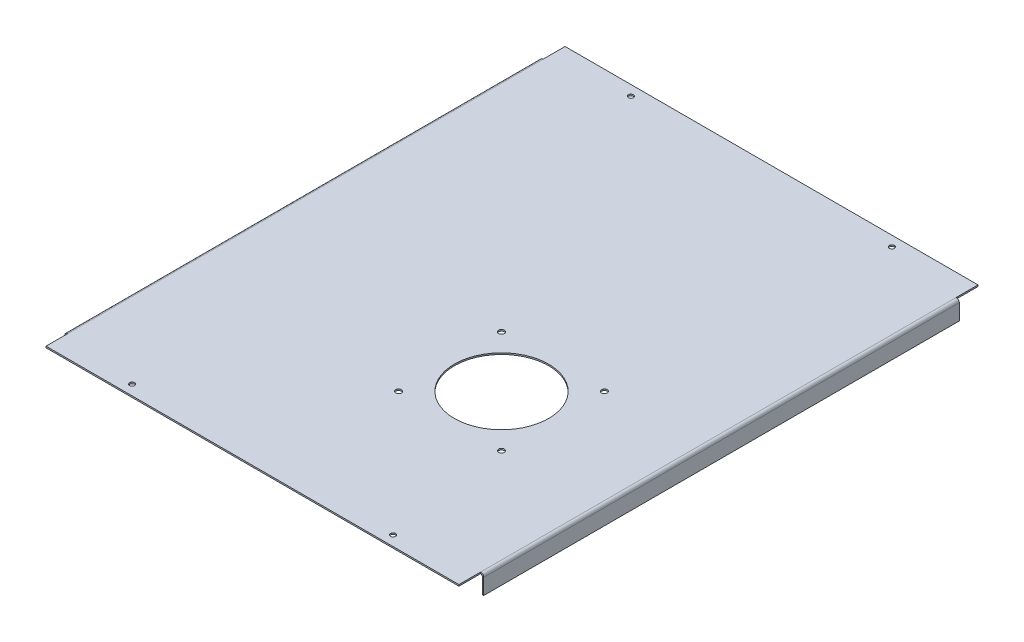
ISO-10303-21;
HEADER;
FILE_DESCRIPTION(('STEP AP214'),'2;1');
FILE_NAME('part.step','',(''),(''),'','','');
FILE_SCHEMA(('AUTOMOTIVE_DESIGN { 1 0 10303 214 1 1 1 1 }'));
ENDSEC;
DATA;
#1=APPLICATION_CONTEXT('core data for automotive mechanical design processes');
#2=APPLICATION_PROTOCOL_DEFINITION('international standard','automotive_design',2000,#1);
#3=PRODUCT_CONTEXT('',#1,'mechanical');
#4=PRODUCT('Part','Part','',(#3));
#5=PRODUCT_RELATED_PRODUCT_CATEGORY('part','',(#4));
#6=PRODUCT_DEFINITION_FORMATION('','',#4);
#7=PRODUCT_DEFINITION_CONTEXT('part definition',#1,'design');
#8=PRODUCT_DEFINITION('design','',#6,#7);
#9=PRODUCT_DEFINITION_SHAPE('','',#8);
#10=(LENGTH_UNIT() NAMED_UNIT(*) SI_UNIT(.MILLI.,.METRE.));
#11=(NAMED_UNIT(*) PLANE_ANGLE_UNIT() SI_UNIT($,.RADIAN.));
#12=(NAMED_UNIT(*) SI_UNIT($,.STERADIAN.) SOLID_ANGLE_UNIT());
#13=UNCERTAINTY_MEASURE_WITH_UNIT(LENGTH_MEASURE(1.E-05),#10,'distance_accuracy_value','');
#14=(GEOMETRIC_REPRESENTATION_CONTEXT(3) GLOBAL_UNCERTAINTY_ASSIGNED_CONTEXT((#13)) GLOBAL_UNIT_ASSIGNED_CONTEXT((#10,
#11,#12)) REPRESENTATION_CONTEXT('',''));
#15=CARTESIAN_POINT('',(0.,0.,0.));
#16=DIRECTION('',(0.,0.,1.));
#17=DIRECTION('',(1.,0.,0.));
#18=AXIS2_PLACEMENT_3D('',#15,#16,#17);
#19=CARTESIAN_POINT('',(0.,-1.,0.));
#20=DIRECTION('',(0.,1.,0.));
#21=DIRECTION('',(0.,0.,1.));
#22=AXIS2_PLACEMENT_3D('',#19,#20,#21);
#23=PLANE('',#22);
#24=CARTESIAN_POINT('',(185.210608040227,-1.,145.66803730873));
#25=DIRECTION('',(0.,-1.,0.));
#26=DIRECTION('',(0.,0.,-1.));
#27=AXIS2_PLACEMENT_3D('',#24,#25,#26);
#28=CIRCLE('',#27,2.);
#29=CARTESIAN_POINT('',(185.210608040227,-1.,143.66803730873));
#30=VERTEX_POINT('',#29);
#31=EDGE_CURVE('E241',#30,#30,#28,.T.);
#32=ORIENTED_EDGE('',*,*,#31,.F.);
#33=EDGE_LOOP('',(#32));
#34=FACE_BOUND('',#33,.T.);
#35=CARTESIAN_POINT('',(114.210608041667,-1.,145.667585056685));
#36=DIRECTION('',(0.,-1.,0.));
#37=DIRECTION('',(0.,0.,-1.));
#38=AXIS2_PLACEMENT_3D('',#35,#36,#37);
#39=CIRCLE('',#38,2.);
#40=CARTESIAN_POINT('',(114.210608041667,-1.,143.667585056685));
#41=VERTEX_POINT('',#40);
#42=EDGE_CURVE('E231',#41,#41,#39,.T.);
#43=ORIENTED_EDGE('',*,*,#42,.F.);
#44=EDGE_LOOP('',(#43));
#45=FACE_BOUND('',#44,.T.);
#46=CARTESIAN_POINT('',(185.210155788181,-1.,216.66803730729));
#47=DIRECTION('',(0.,-1.,0.));
#48=DIRECTION('',(0.,0.,-1.));
#49=AXIS2_PLACEMENT_3D('',#46,#47,#48);
#50=CIRCLE('',#49,2.);
#51=CARTESIAN_POINT('',(185.210155788181,-1.,214.66803730729));
#52=VERTEX_POINT('',#51);
#53=EDGE_CURVE('E228',#52,#52,#50,.T.);
#54=ORIENTED_EDGE('',*,*,#53,.F.);
#55=EDGE_LOOP('',(#54));
#56=FACE_BOUND('',#55,.T.);
#57=CARTESIAN_POINT('',(114.210155789621,-1.,216.667585055244));
#58=DIRECTION('',(0.,-1.,0.));
#59=DIRECTION('',(0.,0.,-1.));
#60=AXIS2_PLACEMENT_3D('',#57,#58,#59);
#61=CIRCLE('',#60,2.);
#62=CARTESIAN_POINT('',(114.210155789621,-1.,214.667585055244));
#63=VERTEX_POINT('',#62);
#64=EDGE_CURVE('E225',#63,#63,#61,.T.);
#65=ORIENTED_EDGE('',*,*,#64,.F.);
#66=EDGE_LOOP('',(#65));
#67=FACE_BOUND('',#66,.T.);
#68=CARTESIAN_POINT('',(149.710381914924,-0.999999999999999,181.167811181987));
#69=DIRECTION('',(0.,1.,0.));
#70=DIRECTION('',(0.,0.,1.));
#71=AXIS2_PLACEMENT_3D('',#68,#69,#70);
#72=CIRCLE('',#71,32.5);
#73=CARTESIAN_POINT('',(149.710381914924,-0.999999999999999,213.667811181987));
#74=VERTEX_POINT('',#73);
#75=EDGE_CURVE('E248',#74,#74,#72,.T.);
#76=ORIENTED_EDGE('',*,*,#75,.T.);
#77=EDGE_LOOP('',(#76));
#78=FACE_BOUND('',#77,.T.);
#79=CARTESIAN_POINT('',(198.072246784864,-0.999999999999999,-39.7062514296918));
#80=DIRECTION('',(0.,1.,0.));
#81=DIRECTION('',(0.,0.,1.));
#82=AXIS2_PLACEMENT_3D('',#79,#80,#81);
#83=CIRCLE('',#82,1.75000000000001);
#84=CARTESIAN_POINT('',(198.072246784864,-0.999999999999999,-37.9562514296918));
#85=VERTEX_POINT('',#84);
#86=EDGE_CURVE('E254',#85,#85,#83,.T.);
#87=ORIENTED_EDGE('',*,*,#86,.T.);
#88=EDGE_LOOP('',(#87));
#89=FACE_BOUND('',#88,.T.);
#90=CARTESIAN_POINT('',(18.0722467848644,-0.999999999999999,-39.7062514296918));
#91=DIRECTION('',(0.,1.,0.));
#92=DIRECTION('',(0.,0.,1.));
#93=AXIS2_PLACEMENT_3D('',#90,#91,#92);
#94=CIRCLE('',#93,1.75);
#95=CARTESIAN_POINT('',(18.0722467848644,-0.999999999999999,-37.9562514296918));
#96=VERTEX_POINT('',#95);
#97=EDGE_CURVE('E260',#96,#96,#94,.T.);
#98=ORIENTED_EDGE('',*,*,#97,.T.);
#99=EDGE_LOOP('',(#98));
#100=FACE_BOUND('',#99,.T.);
#101=CARTESIAN_POINT('',(198.072246784864,-0.999999999999999,304.293748570308));
#102=DIRECTION('',(0.,1.,0.));
#103=DIRECTION('',(0.,0.,1.));
#104=AXIS2_PLACEMENT_3D('',#101,#102,#103);
#105=CIRCLE('',#104,1.75000000000001);
#106=CARTESIAN_POINT('',(198.072246784864,-0.999999999999999,306.043748570308));
#107=VERTEX_POINT('',#106);
#108=EDGE_CURVE('E266',#107,#107,#105,.T.);
#109=ORIENTED_EDGE('',*,*,#108,.T.);
#110=EDGE_LOOP('',(#109));
#111=FACE_BOUND('',#110,.T.);
#112=CARTESIAN_POINT('',(18.0722467848645,-0.999999999999999,304.293748570308));
#113=DIRECTION('',(0.,1.,0.));
#114=DIRECTION('',(0.,0.,1.));
#115=AXIS2_PLACEMENT_3D('',#112,#113,#114);
#116=CIRCLE('',#115,1.75);
#117=CARTESIAN_POINT('',(18.0722467848645,-0.999999999999999,306.043748570308));
#118=VERTEX_POINT('',#117);
#119=EDGE_CURVE('E156',#118,#118,#116,.T.);
#120=ORIENTED_EDGE('',*,*,#119,.T.);
#121=EDGE_LOOP('',(#120));
#122=FACE_BOUND('',#121,.T.);
#123=DIRECTION('',(0.,0.,-1.));
#124=VECTOR('',#123,1.);
#125=CARTESIAN_POINT('',(-34.3277532151356,-1.00000000000002,-46.7062514296918));
#126=LINE('',#125,#124);
#127=CARTESIAN_POINT('',(-34.3277532151356,-1.00000000000001,-46.7062514296918));
#128=VERTEX_POINT('',#127);
#129=CARTESIAN_POINT('',(-34.3277532151356,-1.00000000000001,-31.7062514296919));
#130=VERTEX_POINT('',#129);
#131=EDGE_CURVE('E166',#128,#130,#126,.F.);
#132=ORIENTED_EDGE('',*,*,#131,.F.);
#133=DIRECTION('',(-1.,0.,0.));
#134=VECTOR('',#133,1.);
#135=CARTESIAN_POINT('',(-35.4277532151356,-1.,-46.7062514296918));
#136=LINE('',#135,#134);
#137=CARTESIAN_POINT('',(250.472246784864,-1.00000000000006,-46.7062514296918));
#138=VERTEX_POINT('',#137);
#139=EDGE_CURVE('E206',#138,#128,#136,.T.);
#140=ORIENTED_EDGE('',*,*,#139,.F.);
#141=DIRECTION('',(0.,0.,1.));
#142=VECTOR('',#141,1.);
#143=CARTESIAN_POINT('',(250.472246784864,-1.00000000000006,311.293748570308));
#144=LINE('',#143,#142);
#145=CARTESIAN_POINT('',(250.472246784864,-1.00000000000006,-31.7062514296918));
#146=VERTEX_POINT('',#145);
#147=EDGE_CURVE('E188',#146,#138,#144,.F.);
#148=ORIENTED_EDGE('',*,*,#147,.F.);
#149=CARTESIAN_POINT('',(250.472246784864,-1.00000000000007,296.293748570308));
#150=VERTEX_POINT('',#149);
#151=EDGE_CURVE('E197',#150,#146,#144,.F.);
#152=ORIENTED_EDGE('',*,*,#151,.F.);
#153=CARTESIAN_POINT('',(250.472246784864,-1.00000000000007,311.293748570308));
#154=VERTEX_POINT('',#153);
#155=EDGE_CURVE('E195',#154,#150,#144,.F.);
#156=ORIENTED_EDGE('',*,*,#155,.F.);
#157=DIRECTION('',(1.,0.,0.));
#158=VECTOR('',#157,1.);
#159=CARTESIAN_POINT('',(-35.4277532151355,-1.,311.293748570308));
#160=LINE('',#159,#158);
#161=CARTESIAN_POINT('',(-34.3277532151355,-1.00000000000001,311.293748570308));
#162=VERTEX_POINT('',#161);
#163=EDGE_CURVE('E203',#162,#154,#160,.T.);
#164=ORIENTED_EDGE('',*,*,#163,.F.);
#165=CARTESIAN_POINT('',(-34.3277532151355,-1.00000000000001,296.293748570308));
#166=VERTEX_POINT('',#165);
#167=EDGE_CURVE('E161',#166,#162,#126,.F.);
#168=ORIENTED_EDGE('',*,*,#167,.F.);
#169=EDGE_CURVE('E164',#130,#166,#126,.F.);
#170=ORIENTED_EDGE('',*,*,#169,.F.);
#171=EDGE_LOOP('',(#132,#140,#148,#152,#156,#164,#168,#170));
#172=FACE_BOUND('',#171,.T.);
#173=ADVANCED_FACE('F34',(#34,#45,#56,#67,#78,#89,#100,#111,#122,#172),#23,.F.);
#174=CARTESIAN_POINT('',(0.,0.,0.));
#175=DIRECTION('',(0.,1.,0.));
#176=DIRECTION('',(0.,0.,1.));
#177=AXIS2_PLACEMENT_3D('',#174,#175,#176);
#178=PLANE('',#177);
#179=CARTESIAN_POINT('',(185.210608040227,0.,145.66803730873));
#180=DIRECTION('',(0.,1.,0.));
#181=DIRECTION('',(0.,0.,1.));
#182=AXIS2_PLACEMENT_3D('',#179,#180,#181);
#183=CIRCLE('',#182,2.);
#184=CARTESIAN_POINT('',(185.210608040227,0.,147.66803730873));
#185=VERTEX_POINT('',#184);
#186=EDGE_CURVE('E38',#185,#185,#183,.T.);
#187=ORIENTED_EDGE('',*,*,#186,.F.);
#188=EDGE_LOOP('',(#187));
#189=FACE_BOUND('',#188,.T.);
#190=CARTESIAN_POINT('',(114.210608041667,0.,145.667585056685));
#191=DIRECTION('',(0.,1.,0.));
#192=DIRECTION('',(0.,0.,1.));
#193=AXIS2_PLACEMENT_3D('',#190,#191,#192);
#194=CIRCLE('',#193,2.);
#195=CARTESIAN_POINT('',(114.210608041667,0.,147.667585056685));
#196=VERTEX_POINT('',#195);
#197=EDGE_CURVE('E229',#196,#196,#194,.T.);
#198=ORIENTED_EDGE('',*,*,#197,.F.);
#199=EDGE_LOOP('',(#198));
#200=FACE_BOUND('',#199,.T.);
#201=CARTESIAN_POINT('',(185.210155788181,0.,216.66803730729));
#202=DIRECTION('',(0.,1.,0.));
#203=DIRECTION('',(0.,0.,1.));
#204=AXIS2_PLACEMENT_3D('',#201,#202,#203);
#205=CIRCLE('',#204,2.);
#206=CARTESIAN_POINT('',(185.210155788181,0.,218.66803730729));
#207=VERTEX_POINT('',#206);
#208=EDGE_CURVE('E226',#207,#207,#205,.T.);
#209=ORIENTED_EDGE('',*,*,#208,.F.);
#210=EDGE_LOOP('',(#209));
#211=FACE_BOUND('',#210,.T.);
#212=CARTESIAN_POINT('',(114.210155789621,0.,216.667585055244));
#213=DIRECTION('',(0.,1.,0.));
#214=DIRECTION('',(0.,0.,1.));
#215=AXIS2_PLACEMENT_3D('',#212,#213,#214);
#216=CIRCLE('',#215,2.);
#217=CARTESIAN_POINT('',(114.210155789621,0.,218.667585055244));
#218=VERTEX_POINT('',#217);
#219=EDGE_CURVE('E221',#218,#218,#216,.T.);
#220=ORIENTED_EDGE('',*,*,#219,.F.);
#221=EDGE_LOOP('',(#220));
#222=FACE_BOUND('',#221,.T.);
#223=CARTESIAN_POINT('',(149.710381914924,0.,181.167811181987));
#224=DIRECTION('',(0.,1.,0.));
#225=DIRECTION('',(0.,0.,1.));
#226=AXIS2_PLACEMENT_3D('',#223,#224,#225);
#227=CIRCLE('',#226,32.5);
#228=CARTESIAN_POINT('',(149.710381914924,0.,213.667811181987));
#229=VERTEX_POINT('',#228);
#230=EDGE_CURVE('E224',#229,#229,#227,.T.);
#231=ORIENTED_EDGE('',*,*,#230,.F.);
#232=EDGE_LOOP('',(#231));
#233=FACE_BOUND('',#232,.T.);
#234=CARTESIAN_POINT('',(198.072246784864,0.,-39.7062514296918));
#235=DIRECTION('',(0.,1.,0.));
#236=DIRECTION('',(0.,0.,1.));
#237=AXIS2_PLACEMENT_3D('',#234,#235,#236);
#238=CIRCLE('',#237,1.75000000000001);
#239=CARTESIAN_POINT('',(198.072246784864,0.,-37.9562514296918));
#240=VERTEX_POINT('',#239);
#241=EDGE_CURVE('E251',#240,#240,#238,.T.);
#242=ORIENTED_EDGE('',*,*,#241,.F.);
#243=EDGE_LOOP('',(#242));
#244=FACE_BOUND('',#243,.T.);
#245=CARTESIAN_POINT('',(18.0722467848644,0.,-39.7062514296918));
#246=DIRECTION('',(0.,1.,0.));
#247=DIRECTION('',(0.,0.,1.));
#248=AXIS2_PLACEMENT_3D('',#245,#246,#247);
#249=CIRCLE('',#248,1.75);
#250=CARTESIAN_POINT('',(18.0722467848644,0.,-37.9562514296918));
#251=VERTEX_POINT('',#250);
#252=EDGE_CURVE('E257',#251,#251,#249,.T.);
#253=ORIENTED_EDGE('',*,*,#252,.F.);
#254=EDGE_LOOP('',(#253));
#255=FACE_BOUND('',#254,.T.);
#256=CARTESIAN_POINT('',(198.072246784864,0.,304.293748570308));
#257=DIRECTION('',(0.,1.,0.));
#258=DIRECTION('',(0.,0.,1.));
#259=AXIS2_PLACEMENT_3D('',#256,#257,#258);
#260=CIRCLE('',#259,1.75000000000001);
#261=CARTESIAN_POINT('',(198.072246784864,0.,306.043748570308));
#262=VERTEX_POINT('',#261);
#263=EDGE_CURVE('E263',#262,#262,#260,.T.);
#264=ORIENTED_EDGE('',*,*,#263,.F.);
#265=EDGE_LOOP('',(#264));
#266=FACE_BOUND('',#265,.T.);
#267=CARTESIAN_POINT('',(18.0722467848645,0.,304.293748570308));
#268=DIRECTION('',(0.,1.,0.));
#269=DIRECTION('',(0.,0.,1.));
#270=AXIS2_PLACEMENT_3D('',#267,#268,#269);
#271=CIRCLE('',#270,1.75);
#272=CARTESIAN_POINT('',(18.0722467848645,0.,306.043748570308));
#273=VERTEX_POINT('',#272);
#274=EDGE_CURVE('E269',#273,#273,#271,.T.);
#275=ORIENTED_EDGE('',*,*,#274,.F.);
#276=EDGE_LOOP('',(#275));
#277=FACE_BOUND('',#276,.T.);
#278=DIRECTION('',(-1.,0.,0.));
#279=VECTOR('',#278,1.);
#280=CARTESIAN_POINT('',(-35.4277532151356,0.,-46.7062514296918));
#281=LINE('',#280,#279);
#282=CARTESIAN_POINT('',(250.472246784864,0.,-46.7062514296918));
#283=VERTEX_POINT('',#282);
#284=CARTESIAN_POINT('',(-34.3277532151356,0.,-46.7062514296918));
#285=VERTEX_POINT('',#284);
#286=EDGE_CURVE('E207',#283,#285,#281,.T.);
#287=ORIENTED_EDGE('',*,*,#286,.T.);
#288=DIRECTION('',(0.,0.,-1.));
#289=VECTOR('',#288,1.);
#290=CARTESIAN_POINT('',(-34.3277532151356,0.,-46.7062514296918));
#291=LINE('',#290,#289);
#292=CARTESIAN_POINT('',(-34.3277532151356,0.,-31.7062514296919));
#293=VERTEX_POINT('',#292);
#294=EDGE_CURVE('E171',#285,#293,#291,.F.);
#295=ORIENTED_EDGE('',*,*,#294,.T.);
#296=CARTESIAN_POINT('',(-34.3277532151355,0.,296.293748570308));
#297=VERTEX_POINT('',#296);
#298=EDGE_CURVE('E174',#293,#297,#291,.F.);
#299=ORIENTED_EDGE('',*,*,#298,.T.);
#300=DIRECTION('',(0.,0.,-1.));
#301=VECTOR('',#300,1.);
#302=CARTESIAN_POINT('',(-34.3277532151357,0.,-46.7062514296918));
#303=LINE('',#302,#301);
#304=CARTESIAN_POINT('',(-34.3277532151355,0.,311.293748570308));
#305=VERTEX_POINT('',#304);
#306=EDGE_CURVE('E295',#297,#305,#303,.F.);
#307=ORIENTED_EDGE('',*,*,#306,.T.);
#308=DIRECTION('',(1.,0.,0.));
#309=VECTOR('',#308,1.);
#310=CARTESIAN_POINT('',(-35.4277532151355,0.,311.293748570308));
#311=LINE('',#310,#309);
#312=CARTESIAN_POINT('',(250.472246784864,0.,311.293748570308));
#313=VERTEX_POINT('',#312);
#314=EDGE_CURVE('E200',#305,#313,#311,.T.);
#315=ORIENTED_EDGE('',*,*,#314,.T.);
#316=DIRECTION('',(0.,0.,1.));
#317=VECTOR('',#316,1.);
#318=CARTESIAN_POINT('',(250.472246784864,0.,311.293748570308));
#319=LINE('',#318,#317);
#320=CARTESIAN_POINT('',(250.472246784864,0.,296.293748570308));
#321=VERTEX_POINT('',#320);
#322=EDGE_CURVE('E190',#313,#321,#319,.F.);
#323=ORIENTED_EDGE('',*,*,#322,.T.);
#324=CARTESIAN_POINT('',(250.472246784864,0.,-31.7062514296918));
#325=VERTEX_POINT('',#324);
#326=EDGE_CURVE('E194',#321,#325,#319,.F.);
#327=ORIENTED_EDGE('',*,*,#326,.T.);
#328=DIRECTION('',(0.,0.,1.));
#329=VECTOR('',#328,1.);
#330=CARTESIAN_POINT('',(250.472246784864,0.,311.293748570308));
#331=LINE('',#330,#329);
#332=EDGE_CURVE('E324',#325,#283,#331,.F.);
#333=ORIENTED_EDGE('',*,*,#332,.T.);
#334=EDGE_LOOP('',(#287,#295,#299,#307,#315,#323,#327,#333));
#335=FACE_BOUND('',#334,.T.);
#336=ADVANCED_FACE('F352',(#189,#200,#211,#222,#233,#244,#255,#266,#277,#335),#178,.T.);
#337=CARTESIAN_POINT('',(-35.4277532151356,-1.,-46.7062514296918));
#338=DIRECTION('',(0.,0.,-1.));
#339=DIRECTION('',(-1.,0.,0.));
#340=AXIS2_PLACEMENT_3D('',#337,#338,#339);
#341=PLANE('',#340);
#342=ORIENTED_EDGE('',*,*,#139,.T.);
#343=DIRECTION('',(0.,1.,0.));
#344=VECTOR('',#343,1.);
#345=CARTESIAN_POINT('',(-34.3277532151356,-1.00000000000002,-46.7062514296918));
#346=LINE('',#345,#344);
#347=EDGE_CURVE('E173',#128,#285,#346,.T.);
#348=ORIENTED_EDGE('',*,*,#347,.T.);
#349=ORIENTED_EDGE('',*,*,#286,.F.);
#350=DIRECTION('',(0.,1.,0.));
#351=VECTOR('',#350,1.);
#352=CARTESIAN_POINT('',(250.472246784864,-1.00000000000006,-46.7062514296919));
#353=LINE('',#352,#351);
#354=EDGE_CURVE('E198',#138,#283,#353,.T.);
#355=ORIENTED_EDGE('',*,*,#354,.F.);
#356=EDGE_LOOP('',(#342,#348,#349,#355));
#357=FACE_BOUND('',#356,.T.);
#358=ADVANCED_FACE('F358',(#357),#341,.T.);
#359=CARTESIAN_POINT('',(-35.4277532151355,-1.,311.293748570308));
#360=DIRECTION('',(0.,0.,1.));
#361=DIRECTION('',(1.,0.,0.));
#362=AXIS2_PLACEMENT_3D('',#359,#360,#361);
#363=PLANE('',#362);
#364=DIRECTION('',(0.,1.,0.));
#365=VECTOR('',#364,1.);
#366=CARTESIAN_POINT('',(-34.3277532151356,-1.00000000000002,311.293748570308));
#367=LINE('',#366,#365);
#368=EDGE_CURVE('E176',#162,#305,#367,.T.);
#369=ORIENTED_EDGE('',*,*,#368,.F.);
#370=ORIENTED_EDGE('',*,*,#163,.T.);
#371=DIRECTION('',(0.,1.,0.));
#372=VECTOR('',#371,1.);
#373=CARTESIAN_POINT('',(250.472246784864,-1.00000000000006,311.293748570308));
#374=LINE('',#373,#372);
#375=EDGE_CURVE('E193',#154,#313,#374,.T.);
#376=ORIENTED_EDGE('',*,*,#375,.T.);
#377=ORIENTED_EDGE('',*,*,#314,.F.);
#378=EDGE_LOOP('',(#369,#370,#376,#377));
#379=FACE_BOUND('',#378,.T.);
#380=ADVANCED_FACE('F36',(#379),#363,.T.);
#381=CARTESIAN_POINT('',(250.472246784864,-2.1,311.293748570308));
#382=DIRECTION('',(0.,0.,1.));
#383=DIRECTION('',(1.,0.,0.));
#384=AXIS2_PLACEMENT_3D('',#381,#382,#383);
#385=CYLINDRICAL_SURFACE('',#384,2.09999999999993);
#386=CARTESIAN_POINT('',(250.472246784864,-2.1,296.293748570308));
#387=DIRECTION('',(0.,0.,-1.));
#388=DIRECTION('',(-1.,0.,0.));
#389=AXIS2_PLACEMENT_3D('',#386,#387,#388);
#390=CIRCLE('',#389,2.09999999999993);
#391=CARTESIAN_POINT('',(252.572246784864,-2.09999999999999,296.293748570308));
#392=VERTEX_POINT('',#391);
#393=EDGE_CURVE('E308',#392,#321,#390,.F.);
#394=ORIENTED_EDGE('',*,*,#393,.F.);
#395=DIRECTION('',(0.,0.,-1.));
#396=VECTOR('',#395,1.);
#397=CARTESIAN_POINT('',(252.572246784864,-2.09999999999999,0.));
#398=LINE('',#397,#396);
#399=CARTESIAN_POINT('',(252.572246784864,-2.09999999999999,-31.7062514296918));
#400=VERTEX_POINT('',#399);
#401=EDGE_CURVE('E183',#392,#400,#398,.T.);
#402=ORIENTED_EDGE('',*,*,#401,.T.);
#403=CARTESIAN_POINT('',(250.472246784864,-2.1,-31.7062514296918));
#404=DIRECTION('',(0.,0.,1.));
#405=DIRECTION('',(1.,0.,0.));
#406=AXIS2_PLACEMENT_3D('',#403,#404,#405);
#407=CIRCLE('',#406,2.09999999999993);
#408=EDGE_CURVE('E321',#325,#400,#407,.F.);
#409=ORIENTED_EDGE('',*,*,#408,.F.);
#410=ORIENTED_EDGE('',*,*,#326,.F.);
#411=EDGE_LOOP('',(#394,#402,#409,#410));
#412=FACE_BOUND('',#411,.T.);
#413=ADVANCED_FACE('F394',(#412),#385,.T.);
#414=CARTESIAN_POINT('',(250.472246784864,-2.1,311.293748570308));
#415=DIRECTION('',(0.,0.,1.));
#416=DIRECTION('',(1.,0.,0.));
#417=AXIS2_PLACEMENT_3D('',#414,#415,#416);
#418=CYLINDRICAL_SURFACE('',#417,1.09999999999993);
#419=DIRECTION('',(0.,0.,1.));
#420=VECTOR('',#419,1.);
#421=CARTESIAN_POINT('',(251.572246784864,-2.09999999999999,-46.7062514296918));
#422=LINE('',#421,#420);
#423=CARTESIAN_POINT('',(251.572246784864,-2.09999999999999,-31.7062514296918));
#424=VERTEX_POINT('',#423);
#425=CARTESIAN_POINT('',(251.572246784864,-2.09999999999999,296.293748570308));
#426=VERTEX_POINT('',#425);
#427=EDGE_CURVE('E178',#424,#426,#422,.T.);
#428=ORIENTED_EDGE('',*,*,#427,.T.);
#429=CARTESIAN_POINT('',(250.472246784864,-2.1,296.293748570308));
#430=DIRECTION('',(0.,0.,-1.));
#431=DIRECTION('',(-1.,0.,0.));
#432=AXIS2_PLACEMENT_3D('',#429,#430,#431);
#433=CIRCLE('',#432,1.09999999999993);
#434=EDGE_CURVE('E305',#426,#150,#433,.F.);
#435=ORIENTED_EDGE('',*,*,#434,.T.);
#436=ORIENTED_EDGE('',*,*,#151,.T.);
#437=CARTESIAN_POINT('',(250.472246784864,-2.1,-31.7062514296918));
#438=DIRECTION('',(0.,0.,1.));
#439=DIRECTION('',(1.,0.,0.));
#440=AXIS2_PLACEMENT_3D('',#437,#438,#439);
#441=CIRCLE('',#440,1.09999999999993);
#442=EDGE_CURVE('E318',#146,#424,#441,.F.);
#443=ORIENTED_EDGE('',*,*,#442,.T.);
#444=EDGE_LOOP('',(#428,#435,#436,#443));
#445=FACE_BOUND('',#444,.T.);
#446=ADVANCED_FACE('F387',(#445),#418,.F.);
#447=CARTESIAN_POINT('',(252.572246784864,1.1672469030996E-12,0.));
#448=DIRECTION('',(-1.,0.,0.));
#449=DIRECTION('',(0.,-1.,0.));
#450=AXIS2_PLACEMENT_3D('',#447,#448,#449);
#451=PLANE('',#450);
#452=ORIENTED_EDGE('',*,*,#401,.F.);
#453=DIRECTION('',(0.,1.,0.));
#454=VECTOR('',#453,1.);
#455=CARTESIAN_POINT('',(252.572246784865,-13.,296.293748570308));
#456=LINE('',#455,#454);
#457=CARTESIAN_POINT('',(252.572246784865,-13.,296.293748570308));
#458=VERTEX_POINT('',#457);
#459=EDGE_CURVE('E298',#458,#392,#456,.T.);
#460=ORIENTED_EDGE('',*,*,#459,.F.);
#461=DIRECTION('',(0.,0.,-1.));
#462=VECTOR('',#461,1.);
#463=CARTESIAN_POINT('',(252.572246784864,-13.,-46.7062514296918));
#464=LINE('',#463,#462);
#465=CARTESIAN_POINT('',(252.572246784864,-13.,-31.7062514296918));
#466=VERTEX_POINT('',#465);
#467=EDGE_CURVE('E186',#458,#466,#464,.T.);
#468=ORIENTED_EDGE('',*,*,#467,.T.);
#469=DIRECTION('',(0.,-1.,0.));
#470=VECTOR('',#469,1.);
#471=CARTESIAN_POINT('',(252.572246784864,-13.,-31.7062514296918));
#472=LINE('',#471,#470);
#473=EDGE_CURVE('E310',#400,#466,#472,.T.);
#474=ORIENTED_EDGE('',*,*,#473,.F.);
#475=EDGE_LOOP('',(#452,#460,#468,#474));
#476=FACE_BOUND('',#475,.T.);
#477=ADVANCED_FACE('F402',(#476),#451,.F.);
#478=CARTESIAN_POINT('',(251.572246784864,1.16375541973849E-12,0.));
#479=DIRECTION('',(-1.,0.,0.));
#480=DIRECTION('',(0.,-1.,0.));
#481=AXIS2_PLACEMENT_3D('',#478,#479,#480);
#482=PLANE('',#481);
#483=DIRECTION('',(0.,-1.,0.));
#484=VECTOR('',#483,1.);
#485=CARTESIAN_POINT('',(251.572246784864,1.16375541973849E-12,296.293748570308));
#486=LINE('',#485,#484);
#487=CARTESIAN_POINT('',(251.572246784865,-13.,296.293748570308));
#488=VERTEX_POINT('',#487);
#489=EDGE_CURVE('E302',#426,#488,#486,.T.);
#490=ORIENTED_EDGE('',*,*,#489,.F.);
#491=ORIENTED_EDGE('',*,*,#427,.F.);
#492=DIRECTION('',(0.,1.,0.));
#493=VECTOR('',#492,1.);
#494=CARTESIAN_POINT('',(251.572246784864,1.16375541973849E-12,-31.7062514296918));
#495=LINE('',#494,#493);
#496=CARTESIAN_POINT('',(251.572246784864,-13.,-31.7062514296918));
#497=VERTEX_POINT('',#496);
#498=EDGE_CURVE('E314',#497,#424,#495,.T.);
#499=ORIENTED_EDGE('',*,*,#498,.F.);
#500=DIRECTION('',(0.,0.,-1.));
#501=VECTOR('',#500,1.);
#502=CARTESIAN_POINT('',(251.572246784864,-13.,-46.7062514296918));
#503=LINE('',#502,#501);
#504=EDGE_CURVE('E185',#488,#497,#503,.T.);
#505=ORIENTED_EDGE('',*,*,#504,.F.);
#506=EDGE_LOOP('',(#490,#491,#499,#505));
#507=FACE_BOUND('',#506,.T.);
#508=ADVANCED_FACE('F409',(#507),#482,.T.);
#509=CARTESIAN_POINT('',(252.572246784864,-13.,-46.7062514296918));
#510=DIRECTION('',(0.,1.,0.));
#511=DIRECTION('',(-1.,0.,0.));
#512=AXIS2_PLACEMENT_3D('',#509,#510,#511);
#513=PLANE('',#512);
#514=ORIENTED_EDGE('',*,*,#467,.F.);
#515=DIRECTION('',(-1.,0.,0.));
#516=VECTOR('',#515,1.);
#517=CARTESIAN_POINT('',(252.572246784865,-13.,296.293748570308));
#518=LINE('',#517,#516);
#519=EDGE_CURVE('E217',#458,#488,#518,.T.);
#520=ORIENTED_EDGE('',*,*,#519,.T.);
#521=ORIENTED_EDGE('',*,*,#504,.T.);
#522=DIRECTION('',(1.,0.,0.));
#523=VECTOR('',#522,1.);
#524=CARTESIAN_POINT('',(252.572246784864,-13.,-31.7062514296918));
#525=LINE('',#524,#523);
#526=EDGE_CURVE('E210',#497,#466,#525,.T.);
#527=ORIENTED_EDGE('',*,*,#526,.T.);
#528=EDGE_LOOP('',(#514,#520,#521,#527));
#529=FACE_BOUND('',#528,.T.);
#530=ADVANCED_FACE('F406',(#529),#513,.F.);
#531=CARTESIAN_POINT('',(-34.3277532151356,-2.1,-46.7062514296918));
#532=DIRECTION('',(0.,0.,-1.));
#533=DIRECTION('',(-1.,0.,0.));
#534=AXIS2_PLACEMENT_3D('',#531,#532,#533);
#535=CYLINDRICAL_SURFACE('',#534,2.09999999999998);
#536=CARTESIAN_POINT('',(-34.3277532151356,-2.1,-31.7062514296919));
#537=DIRECTION('',(0.,0.,1.));
#538=DIRECTION('',(1.,0.,0.));
#539=AXIS2_PLACEMENT_3D('',#536,#537,#538);
#540=CIRCLE('',#539,2.09999999999998);
#541=CARTESIAN_POINT('',(-36.4277532151356,-2.09999999999999,-31.7062514296919));
#542=VERTEX_POINT('',#541);
#543=EDGE_CURVE('E280',#542,#293,#540,.F.);
#544=ORIENTED_EDGE('',*,*,#543,.F.);
#545=DIRECTION('',(0.,0.,1.));
#546=VECTOR('',#545,1.);
#547=CARTESIAN_POINT('',(-36.4277532151356,-2.09999999999999,0.));
#548=LINE('',#547,#546);
#549=CARTESIAN_POINT('',(-36.4277532151355,-2.09999999999999,296.293748570308));
#550=VERTEX_POINT('',#549);
#551=EDGE_CURVE('E154',#542,#550,#548,.T.);
#552=ORIENTED_EDGE('',*,*,#551,.T.);
#553=CARTESIAN_POINT('',(-34.3277532151356,-2.1,296.293748570308));
#554=DIRECTION('',(0.,0.,-1.));
#555=DIRECTION('',(-1.,0.,0.));
#556=AXIS2_PLACEMENT_3D('',#553,#554,#555);
#557=CIRCLE('',#556,2.09999999999998);
#558=EDGE_CURVE('E292',#297,#550,#557,.F.);
#559=ORIENTED_EDGE('',*,*,#558,.F.);
#560=ORIENTED_EDGE('',*,*,#298,.F.);
#561=EDGE_LOOP('',(#544,#552,#559,#560));
#562=FACE_BOUND('',#561,.T.);
#563=ADVANCED_FACE('F332',(#562),#535,.T.);
#564=CARTESIAN_POINT('',(-34.3277532151356,-2.1,-46.7062514296918));
#565=DIRECTION('',(0.,0.,-1.));
#566=DIRECTION('',(-1.,0.,0.));
#567=AXIS2_PLACEMENT_3D('',#564,#565,#566);
#568=CYLINDRICAL_SURFACE('',#567,1.09999999999998);
#569=DIRECTION('',(0.,0.,-1.));
#570=VECTOR('',#569,1.);
#571=CARTESIAN_POINT('',(-35.4277532151355,-2.1,311.293748570308));
#572=LINE('',#571,#570);
#573=CARTESIAN_POINT('',(-35.4277532151355,-2.09999999999999,296.293748570308));
#574=VERTEX_POINT('',#573);
#575=CARTESIAN_POINT('',(-35.4277532151356,-2.09999999999999,-31.7062514296919));
#576=VERTEX_POINT('',#575);
#577=EDGE_CURVE('E326',#574,#576,#572,.T.);
#578=ORIENTED_EDGE('',*,*,#577,.T.);
#579=CARTESIAN_POINT('',(-34.3277532151356,-2.1,-31.7062514296919));
#580=DIRECTION('',(0.,0.,1.));
#581=DIRECTION('',(1.,0.,0.));
#582=AXIS2_PLACEMENT_3D('',#579,#580,#581);
#583=CIRCLE('',#582,1.09999999999998);
#584=EDGE_CURVE('E277',#576,#130,#583,.F.);
#585=ORIENTED_EDGE('',*,*,#584,.T.);
#586=ORIENTED_EDGE('',*,*,#169,.T.);
#587=CARTESIAN_POINT('',(-34.3277532151356,-2.1,296.293748570308));
#588=DIRECTION('',(0.,0.,-1.));
#589=DIRECTION('',(-1.,0.,0.));
#590=AXIS2_PLACEMENT_3D('',#587,#588,#589);
#591=CIRCLE('',#590,1.09999999999998);
#592=EDGE_CURVE('E289',#166,#574,#591,.F.);
#593=ORIENTED_EDGE('',*,*,#592,.T.);
#594=EDGE_LOOP('',(#578,#585,#586,#593));
#595=FACE_BOUND('',#594,.T.);
#596=ADVANCED_FACE('F362',(#595),#568,.F.);
#597=CARTESIAN_POINT('',(-36.4277532151356,1.26406193767926E-13,0.));
#598=DIRECTION('',(1.,0.,0.));
#599=DIRECTION('',(0.,1.,0.));
#600=AXIS2_PLACEMENT_3D('',#597,#598,#599);
#601=PLANE('',#600);
#602=ORIENTED_EDGE('',*,*,#551,.F.);
#603=DIRECTION('',(0.,1.,0.));
#604=VECTOR('',#603,1.);
#605=CARTESIAN_POINT('',(-36.4277532151356,-13.,-31.7062514296919));
#606=LINE('',#605,#604);
#607=CARTESIAN_POINT('',(-36.4277532151356,-13.,-31.7062514296919));
#608=VERTEX_POINT('',#607);
#609=EDGE_CURVE('E148',#608,#542,#606,.T.);
#610=ORIENTED_EDGE('',*,*,#609,.F.);
#611=DIRECTION('',(0.,0.,1.));
#612=VECTOR('',#611,1.);
#613=CARTESIAN_POINT('',(-36.4277532151356,-13.,311.293748570308));
#614=LINE('',#613,#612);
#615=CARTESIAN_POINT('',(-36.4277532151356,-13.,296.293748570308));
#616=VERTEX_POINT('',#615);
#617=EDGE_CURVE('E58',#608,#616,#614,.T.);
#618=ORIENTED_EDGE('',*,*,#617,.T.);
#619=DIRECTION('',(0.,-1.,0.));
#620=VECTOR('',#619,1.);
#621=CARTESIAN_POINT('',(-36.4277532151356,-13.,296.293748570308));
#622=LINE('',#621,#620);
#623=EDGE_CURVE('E282',#550,#616,#622,.T.);
#624=ORIENTED_EDGE('',*,*,#623,.F.);
#625=EDGE_LOOP('',(#602,#610,#618,#624));
#626=FACE_BOUND('',#625,.T.);
#627=ADVANCED_FACE('F153',(#626),#601,.F.);
#628=CARTESIAN_POINT('',(-35.4277532151356,1.22914710406817E-13,0.));
#629=DIRECTION('',(1.,0.,0.));
#630=DIRECTION('',(0.,1.,0.));
#631=AXIS2_PLACEMENT_3D('',#628,#629,#630);
#632=PLANE('',#631);
#633=DIRECTION('',(0.,-1.,0.));
#634=VECTOR('',#633,1.);
#635=CARTESIAN_POINT('',(-35.4277532151356,1.22914710406817E-13,-31.7062514296919));
#636=LINE('',#635,#634);
#637=CARTESIAN_POINT('',(-35.4277532151356,-13.,-31.7062514296919));
#638=VERTEX_POINT('',#637);
#639=EDGE_CURVE('E51',#576,#638,#636,.T.);
#640=ORIENTED_EDGE('',*,*,#639,.F.);
#641=ORIENTED_EDGE('',*,*,#577,.F.);
#642=DIRECTION('',(0.,1.,0.));
#643=VECTOR('',#642,1.);
#644=CARTESIAN_POINT('',(-35.4277532151355,1.22914710406817E-13,296.293748570308));
#645=LINE('',#644,#643);
#646=CARTESIAN_POINT('',(-35.4277532151356,-13.,296.293748570308));
#647=VERTEX_POINT('',#646);
#648=EDGE_CURVE('E286',#647,#574,#645,.T.);
#649=ORIENTED_EDGE('',*,*,#648,.F.);
#650=DIRECTION('',(0.,0.,1.));
#651=VECTOR('',#650,1.);
#652=CARTESIAN_POINT('',(-35.4277532151356,-13.,311.293748570308));
#653=LINE('',#652,#651);
#654=EDGE_CURVE('E162',#638,#647,#653,.T.);
#655=ORIENTED_EDGE('',*,*,#654,.F.);
#656=EDGE_LOOP('',(#640,#641,#649,#655));
#657=FACE_BOUND('',#656,.T.);
#658=ADVANCED_FACE('F365',(#657),#632,.T.);
#659=CARTESIAN_POINT('',(-36.4277532151356,-13.,311.293748570308));
#660=DIRECTION('',(0.,1.,0.));
#661=DIRECTION('',(-1.,0.,0.));
#662=AXIS2_PLACEMENT_3D('',#659,#660,#661);
#663=PLANE('',#662);
#664=ORIENTED_EDGE('',*,*,#617,.F.);
#665=DIRECTION('',(1.,0.,0.));
#666=VECTOR('',#665,1.);
#667=CARTESIAN_POINT('',(-36.4277532151356,-13.,-31.7062514296919));
#668=LINE('',#667,#666);
#669=EDGE_CURVE('E11',#608,#638,#668,.T.);
#670=ORIENTED_EDGE('',*,*,#669,.T.);
#671=ORIENTED_EDGE('',*,*,#654,.T.);
#672=DIRECTION('',(-1.,0.,0.));
#673=VECTOR('',#672,1.);
#674=CARTESIAN_POINT('',(-36.4277532151356,-13.,296.293748570308));
#675=LINE('',#674,#673);
#676=EDGE_CURVE('E43',#647,#616,#675,.T.);
#677=ORIENTED_EDGE('',*,*,#676,.T.);
#678=EDGE_LOOP('',(#664,#670,#671,#677));
#679=FACE_BOUND('',#678,.T.);
#680=ADVANCED_FACE('F159',(#679),#663,.F.);
#681=CARTESIAN_POINT('',(250.472246784864,9.24990627740742E-13,0.));
#682=DIRECTION('',(1.,0.,0.));
#683=DIRECTION('',(0.,1.,0.));
#684=AXIS2_PLACEMENT_3D('',#681,#682,#683);
#685=PLANE('',#684);
#686=DIRECTION('',(0.,-1.,0.));
#687=VECTOR('',#686,1.);
#688=CARTESIAN_POINT('',(250.472246784864,-13.,-31.7062514296918));
#689=LINE('',#688,#687);
#690=EDGE_CURVE('E311',#325,#146,#689,.T.);
#691=ORIENTED_EDGE('',*,*,#690,.T.);
#692=ORIENTED_EDGE('',*,*,#147,.T.);
#693=ORIENTED_EDGE('',*,*,#354,.T.);
#694=ORIENTED_EDGE('',*,*,#332,.F.);
#695=EDGE_LOOP('',(#691,#692,#693,#694));
#696=FACE_BOUND('',#695,.T.);
#697=ADVANCED_FACE('F372',(#696),#685,.T.);
#698=CARTESIAN_POINT('',(250.472246784864,-13.,-31.7062514296918));
#699=DIRECTION('',(0.,0.,1.));
#700=DIRECTION('',(1.,0.,0.));
#701=AXIS2_PLACEMENT_3D('',#698,#699,#700);
#702=PLANE('',#701);
#703=ORIENTED_EDGE('',*,*,#408,.T.);
#704=ORIENTED_EDGE('',*,*,#473,.T.);
#705=ORIENTED_EDGE('',*,*,#526,.F.);
#706=ORIENTED_EDGE('',*,*,#498,.T.);
#707=ORIENTED_EDGE('',*,*,#442,.F.);
#708=ORIENTED_EDGE('',*,*,#690,.F.);
#709=EDGE_LOOP('',(#703,#704,#705,#706,#707,#708));
#710=FACE_BOUND('',#709,.T.);
#711=ADVANCED_FACE('F566',(#710),#702,.F.);
#712=CARTESIAN_POINT('',(250.472246784864,9.4424037447404E-13,0.));
#713=DIRECTION('',(-1.,0.,0.));
#714=DIRECTION('',(0.,-1.,0.));
#715=AXIS2_PLACEMENT_3D('',#712,#713,#714);
#716=PLANE('',#715);
#717=ORIENTED_EDGE('',*,*,#322,.F.);
#718=ORIENTED_EDGE('',*,*,#375,.F.);
#719=ORIENTED_EDGE('',*,*,#155,.T.);
#720=DIRECTION('',(0.,1.,0.));
#721=VECTOR('',#720,1.);
#722=CARTESIAN_POINT('',(250.472246784865,-13.,296.293748570308));
#723=LINE('',#722,#721);
#724=EDGE_CURVE('E299',#150,#321,#723,.T.);
#725=ORIENTED_EDGE('',*,*,#724,.T.);
#726=EDGE_LOOP('',(#717,#718,#719,#725));
#727=FACE_BOUND('',#726,.T.);
#728=ADVANCED_FACE('F563',(#727),#716,.F.);
#729=CARTESIAN_POINT('',(250.472246784865,-13.,296.293748570308));
#730=DIRECTION('',(0.,0.,-1.));
#731=DIRECTION('',(-1.,0.,0.));
#732=AXIS2_PLACEMENT_3D('',#729,#730,#731);
#733=PLANE('',#732);
#734=ORIENTED_EDGE('',*,*,#393,.T.);
#735=ORIENTED_EDGE('',*,*,#724,.F.);
#736=ORIENTED_EDGE('',*,*,#434,.F.);
#737=ORIENTED_EDGE('',*,*,#489,.T.);
#738=ORIENTED_EDGE('',*,*,#519,.F.);
#739=ORIENTED_EDGE('',*,*,#459,.T.);
#740=EDGE_LOOP('',(#734,#735,#736,#737,#738,#739));
#741=FACE_BOUND('',#740,.T.);
#742=ADVANCED_FACE('F561',(#741),#733,.F.);
#743=CARTESIAN_POINT('',(-34.3277532151357,1.29064017773637E-13,0.));
#744=DIRECTION('',(-1.,0.,0.));
#745=DIRECTION('',(0.,-1.,0.));
#746=AXIS2_PLACEMENT_3D('',#743,#744,#745);
#747=PLANE('',#746);
#748=DIRECTION('',(0.,-1.,0.));
#749=VECTOR('',#748,1.);
#750=CARTESIAN_POINT('',(-34.3277532151356,-13.,296.293748570308));
#751=LINE('',#750,#749);
#752=EDGE_CURVE('E283',#297,#166,#751,.T.);
#753=ORIENTED_EDGE('',*,*,#752,.T.);
#754=ORIENTED_EDGE('',*,*,#167,.T.);
#755=ORIENTED_EDGE('',*,*,#368,.T.);
#756=ORIENTED_EDGE('',*,*,#306,.F.);
#757=EDGE_LOOP('',(#753,#754,#755,#756));
#758=FACE_BOUND('',#757,.T.);
#759=ADVANCED_FACE('F341',(#758),#747,.T.);
#760=CARTESIAN_POINT('',(-34.3277532151356,-13.,296.293748570308));
#761=DIRECTION('',(0.,0.,-1.));
#762=DIRECTION('',(-1.,0.,0.));
#763=AXIS2_PLACEMENT_3D('',#760,#761,#762);
#764=PLANE('',#763);
#765=ORIENTED_EDGE('',*,*,#558,.T.);
#766=ORIENTED_EDGE('',*,*,#623,.T.);
#767=ORIENTED_EDGE('',*,*,#676,.F.);
#768=ORIENTED_EDGE('',*,*,#648,.T.);
#769=ORIENTED_EDGE('',*,*,#592,.F.);
#770=ORIENTED_EDGE('',*,*,#752,.F.);
#771=EDGE_LOOP('',(#765,#766,#767,#768,#769,#770));
#772=FACE_BOUND('',#771,.T.);
#773=ADVANCED_FACE('F336',(#772),#764,.F.);
#774=CARTESIAN_POINT('',(-34.3277532151356,1.14451177591875E-13,0.));
#775=DIRECTION('',(1.,0.,0.));
#776=DIRECTION('',(0.,1.,0.));
#777=AXIS2_PLACEMENT_3D('',#774,#775,#776);
#778=PLANE('',#777);
#779=ORIENTED_EDGE('',*,*,#294,.F.);
#780=ORIENTED_EDGE('',*,*,#347,.F.);
#781=ORIENTED_EDGE('',*,*,#131,.T.);
#782=DIRECTION('',(0.,1.,0.));
#783=VECTOR('',#782,1.);
#784=CARTESIAN_POINT('',(-34.3277532151356,-13.,-31.7062514296919));
#785=LINE('',#784,#783);
#786=EDGE_CURVE('E155',#130,#293,#785,.T.);
#787=ORIENTED_EDGE('',*,*,#786,.T.);
#788=EDGE_LOOP('',(#779,#780,#781,#787));
#789=FACE_BOUND('',#788,.T.);
#790=ADVANCED_FACE('F355',(#789),#778,.F.);
#791=CARTESIAN_POINT('',(-34.3277532151356,-13.,-31.7062514296919));
#792=DIRECTION('',(0.,0.,1.));
#793=DIRECTION('',(1.,0.,0.));
#794=AXIS2_PLACEMENT_3D('',#791,#792,#793);
#795=PLANE('',#794);
#796=ORIENTED_EDGE('',*,*,#543,.T.);
#797=ORIENTED_EDGE('',*,*,#786,.F.);
#798=ORIENTED_EDGE('',*,*,#584,.F.);
#799=ORIENTED_EDGE('',*,*,#639,.T.);
#800=ORIENTED_EDGE('',*,*,#669,.F.);
#801=ORIENTED_EDGE('',*,*,#609,.T.);
#802=EDGE_LOOP('',(#796,#797,#798,#799,#800,#801));
#803=FACE_BOUND('',#802,.T.);
#804=ADVANCED_FACE('F147',(#803),#795,.F.);
#805=CARTESIAN_POINT('',(18.0722467848645,-10.,304.293748570308));
#806=DIRECTION('',(0.,1.,0.));
#807=DIRECTION('',(0.,0.,1.));
#808=AXIS2_PLACEMENT_3D('',#805,#806,#807);
#809=CYLINDRICAL_SURFACE('',#808,1.75);
#810=ORIENTED_EDGE('',*,*,#274,.T.);
#811=EDGE_LOOP('',(#810));
#812=FACE_BOUND('',#811,.T.);
#813=ORIENTED_EDGE('',*,*,#119,.F.);
#814=EDGE_LOOP('',(#813));
#815=FACE_BOUND('',#814,.T.);
#816=ADVANCED_FACE('F466',(#812,#815),#809,.F.);
#817=CARTESIAN_POINT('',(198.072246784864,-10.,304.293748570308));
#818=DIRECTION('',(0.,1.,0.));
#819=DIRECTION('',(0.,0.,1.));
#820=AXIS2_PLACEMENT_3D('',#817,#818,#819);
#821=CYLINDRICAL_SURFACE('',#820,1.75000000000001);
#822=ORIENTED_EDGE('',*,*,#263,.T.);
#823=EDGE_LOOP('',(#822));
#824=FACE_BOUND('',#823,.T.);
#825=ORIENTED_EDGE('',*,*,#108,.F.);
#826=EDGE_LOOP('',(#825));
#827=FACE_BOUND('',#826,.T.);
#828=ADVANCED_FACE('F475',(#824,#827),#821,.F.);
#829=CARTESIAN_POINT('',(18.0722467848644,-10.,-39.7062514296918));
#830=DIRECTION('',(0.,1.,0.));
#831=DIRECTION('',(0.,0.,1.));
#832=AXIS2_PLACEMENT_3D('',#829,#830,#831);
#833=CYLINDRICAL_SURFACE('',#832,1.75);
#834=ORIENTED_EDGE('',*,*,#252,.T.);
#835=EDGE_LOOP('',(#834));
#836=FACE_BOUND('',#835,.T.);
#837=ORIENTED_EDGE('',*,*,#97,.F.);
#838=EDGE_LOOP('',(#837));
#839=FACE_BOUND('',#838,.T.);
#840=ADVANCED_FACE('F485',(#836,#839),#833,.F.);
#841=CARTESIAN_POINT('',(198.072246784864,-10.,-39.7062514296918));
#842=DIRECTION('',(0.,1.,0.));
#843=DIRECTION('',(0.,0.,1.));
#844=AXIS2_PLACEMENT_3D('',#841,#842,#843);
#845=CYLINDRICAL_SURFACE('',#844,1.75000000000001);
#846=ORIENTED_EDGE('',*,*,#241,.T.);
#847=EDGE_LOOP('',(#846));
#848=FACE_BOUND('',#847,.T.);
#849=ORIENTED_EDGE('',*,*,#86,.F.);
#850=EDGE_LOOP('',(#849));
#851=FACE_BOUND('',#850,.T.);
#852=ADVANCED_FACE('F495',(#848,#851),#845,.F.);
#853=CARTESIAN_POINT('',(149.710381914924,-10.,181.167811181987));
#854=DIRECTION('',(0.,1.,0.));
#855=DIRECTION('',(0.,0.,1.));
#856=AXIS2_PLACEMENT_3D('',#853,#854,#855);
#857=CYLINDRICAL_SURFACE('',#856,32.5);
#858=ORIENTED_EDGE('',*,*,#230,.T.);
#859=EDGE_LOOP('',(#858));
#860=FACE_BOUND('',#859,.T.);
#861=ORIENTED_EDGE('',*,*,#75,.F.);
#862=EDGE_LOOP('',(#861));
#863=FACE_BOUND('',#862,.T.);
#864=ADVANCED_FACE('F504',(#860,#863),#857,.F.);
#865=CARTESIAN_POINT('',(114.210155789621,9.,216.667585055244));
#866=DIRECTION('',(0.,-1.,0.));
#867=DIRECTION('',(0.,0.,-1.));
#868=AXIS2_PLACEMENT_3D('',#865,#866,#867);
#869=CYLINDRICAL_SURFACE('',#868,2.);
#870=ORIENTED_EDGE('',*,*,#219,.T.);
#871=EDGE_LOOP('',(#870));
#872=FACE_BOUND('',#871,.T.);
#873=ORIENTED_EDGE('',*,*,#64,.T.);
#874=EDGE_LOOP('',(#873));
#875=FACE_BOUND('',#874,.T.);
#876=ADVANCED_FACE('F513',(#872,#875),#869,.F.);
#877=CARTESIAN_POINT('',(185.210155788181,9.,216.66803730729));
#878=DIRECTION('',(0.,-1.,0.));
#879=DIRECTION('',(0.,0.,-1.));
#880=AXIS2_PLACEMENT_3D('',#877,#878,#879);
#881=CYLINDRICAL_SURFACE('',#880,2.);
#882=ORIENTED_EDGE('',*,*,#208,.T.);
#883=EDGE_LOOP('',(#882));
#884=FACE_BOUND('',#883,.T.);
#885=ORIENTED_EDGE('',*,*,#53,.T.);
#886=EDGE_LOOP('',(#885));
#887=FACE_BOUND('',#886,.T.);
#888=ADVANCED_FACE('F524',(#884,#887),#881,.F.);
#889=CARTESIAN_POINT('',(114.210608041667,9.,145.667585056685));
#890=DIRECTION('',(0.,-1.,0.));
#891=DIRECTION('',(0.,0.,-1.));
#892=AXIS2_PLACEMENT_3D('',#889,#890,#891);
#893=CYLINDRICAL_SURFACE('',#892,2.);
#894=ORIENTED_EDGE('',*,*,#197,.T.);
#895=EDGE_LOOP('',(#894));
#896=FACE_BOUND('',#895,.T.);
#897=ORIENTED_EDGE('',*,*,#42,.T.);
#898=EDGE_LOOP('',(#897));
#899=FACE_BOUND('',#898,.T.);
#900=ADVANCED_FACE('F531',(#896,#899),#893,.F.);
#901=CARTESIAN_POINT('',(185.210608040227,9.,145.66803730873));
#902=DIRECTION('',(0.,-1.,0.));
#903=DIRECTION('',(0.,0.,-1.));
#904=AXIS2_PLACEMENT_3D('',#901,#902,#903);
#905=CYLINDRICAL_SURFACE('',#904,2.);
#906=ORIENTED_EDGE('',*,*,#186,.T.);
#907=EDGE_LOOP('',(#906));
#908=FACE_BOUND('',#907,.T.);
#909=ORIENTED_EDGE('',*,*,#31,.T.);
#910=EDGE_LOOP('',(#909));
#911=FACE_BOUND('',#910,.T.);
#912=ADVANCED_FACE('F539',(#908,#911),#905,.F.);
#913=CLOSED_SHELL('',(#173,#336,#358,#380,#413,#446,#477,#508,#530,#563,#596,#627,#658,#680,
#697,#711,#728,#742,#759,#773,#790,#804,#816,#828,#840,#852,#864,#876,#888,#900,#912));
#914=MANIFOLD_SOLID_BREP('B2',#913);
#915=ADVANCED_BREP_SHAPE_REPRESENTATION('',(#18,#914),#14);
#916=SHAPE_DEFINITION_REPRESENTATION(#9,#915);
ENDSEC;
END-ISO-10303-21;
